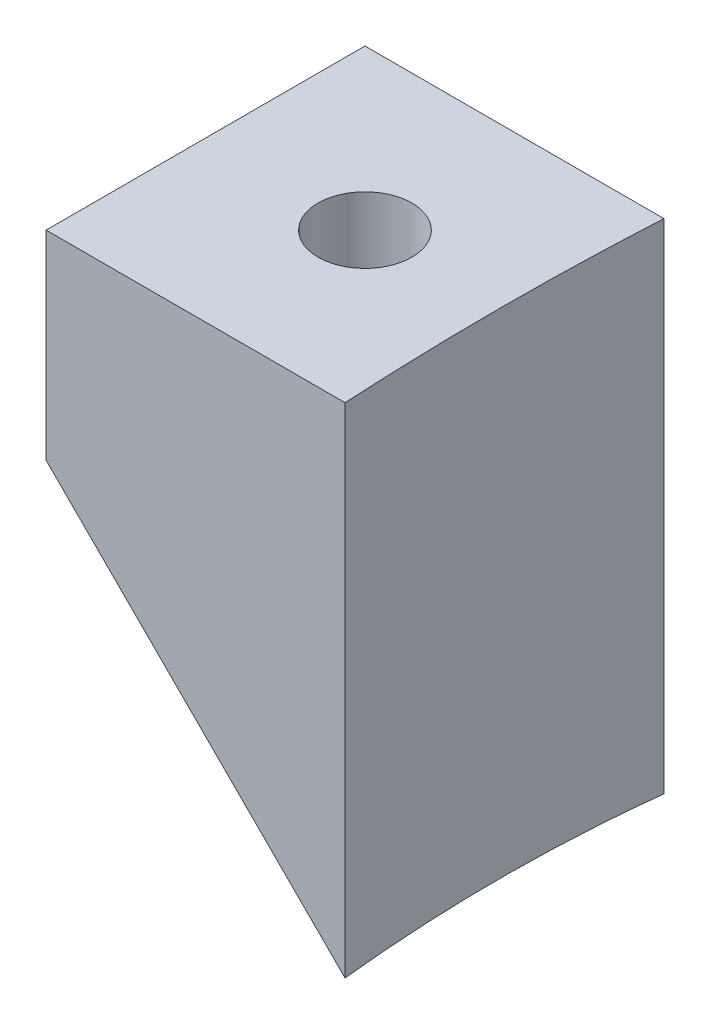
ISO-10303-21;
HEADER;
FILE_DESCRIPTION(('STEP AP214'),'2;1');
FILE_NAME('part.step','',(''),(''),'','','');
FILE_SCHEMA(('AUTOMOTIVE_DESIGN { 1 0 10303 214 1 1 1 1 }'));
ENDSEC;
DATA;
#1=APPLICATION_CONTEXT('core data for automotive mechanical design processes');
#2=APPLICATION_PROTOCOL_DEFINITION('international standard','automotive_design',2000,#1);
#3=PRODUCT_CONTEXT('',#1,'mechanical');
#4=PRODUCT('Part','Part','',(#3));
#5=PRODUCT_RELATED_PRODUCT_CATEGORY('part','',(#4));
#6=PRODUCT_DEFINITION_FORMATION('','',#4);
#7=PRODUCT_DEFINITION_CONTEXT('part definition',#1,'design');
#8=PRODUCT_DEFINITION('design','',#6,#7);
#9=PRODUCT_DEFINITION_SHAPE('','',#8);
#10=(LENGTH_UNIT() NAMED_UNIT(*) SI_UNIT(.MILLI.,.METRE.));
#11=(NAMED_UNIT(*) PLANE_ANGLE_UNIT() SI_UNIT($,.RADIAN.));
#12=(NAMED_UNIT(*) SI_UNIT($,.STERADIAN.) SOLID_ANGLE_UNIT());
#13=UNCERTAINTY_MEASURE_WITH_UNIT(LENGTH_MEASURE(1.E-05),#10,'distance_accuracy_value','');
#14=(GEOMETRIC_REPRESENTATION_CONTEXT(3) GLOBAL_UNCERTAINTY_ASSIGNED_CONTEXT((#13)) GLOBAL_UNIT_ASSIGNED_CONTEXT((#10,
#11,#12)) REPRESENTATION_CONTEXT('',''));
#15=CARTESIAN_POINT('',(0.,0.,0.));
#16=DIRECTION('',(0.,0.,1.));
#17=DIRECTION('',(1.,0.,0.));
#18=AXIS2_PLACEMENT_3D('',#15,#16,#17);
#19=CARTESIAN_POINT('',(0.,22.016162892,0.));
#20=DIRECTION('',(0.,1.,0.));
#21=DIRECTION('',(0.,0.,1.));
#22=AXIS2_PLACEMENT_3D('',#19,#20,#21);
#23=CYLINDRICAL_SURFACE('',#22,184.298091778145);
#24=DIRECTION('',(0.,1.,0.));
#25=VECTOR('',#24,1.);
#26=CARTESIAN_POINT('',(-184.017828030508,22.016162892,10.16));
#27=LINE('',#26,#25);
#28=CARTESIAN_POINT('',(-184.017828030508,41.0661628920005,10.16));
#29=VERTEX_POINT('',#28);
#30=CARTESIAN_POINT('',(-184.017828030508,72.816162892,10.16));
#31=VERTEX_POINT('',#30);
#32=EDGE_CURVE('E11',#29,#31,#27,.T.);
#33=ORIENTED_EDGE('',*,*,#32,.F.);
#34=CARTESIAN_POINT('',(0.,-142.95166513851,0.));
#35=DIRECTION('',(-0.707106781186551,-0.707106781186544,0.));
#36=DIRECTION('',(-0.707106781186544,0.707106781186551,0.));
#37=AXIS2_PLACEMENT_3D('',#34,#35,#36);
#38=ELLIPSE('',#37,260.636860912136,184.298091778145);
#39=CARTESIAN_POINT('',(-184.017828030508,41.0661628920004,-10.16));
#40=VERTEX_POINT('',#39);
#41=EDGE_CURVE('E25',#29,#40,#38,.T.);
#42=ORIENTED_EDGE('',*,*,#41,.T.);
#43=DIRECTION('',(0.,1.,0.));
#44=VECTOR('',#43,1.);
#45=CARTESIAN_POINT('',(-184.017828030508,22.016162892,-10.16));
#46=LINE('',#45,#44);
#47=CARTESIAN_POINT('',(-184.017828030508,72.816162892,-10.16));
#48=VERTEX_POINT('',#47);
#49=EDGE_CURVE('E115',#40,#48,#46,.T.);
#50=ORIENTED_EDGE('',*,*,#49,.T.);
#51=CARTESIAN_POINT('',(0.,72.816162892,0.));
#52=DIRECTION('',(0.,-1.,0.));
#53=DIRECTION('',(0.,0.,1.));
#54=AXIS2_PLACEMENT_3D('',#51,#52,#53);
#55=CIRCLE('',#54,184.298091778145);
#56=EDGE_CURVE('E91',#31,#48,#55,.T.);
#57=ORIENTED_EDGE('',*,*,#56,.F.);
#58=EDGE_LOOP('',(#33,#42,#50,#57));
#59=FACE_BOUND('',#58,.T.);
#60=ADVANCED_FACE('F17',(#59),#23,.F.);
#61=CARTESIAN_POINT('',(-184.017828030508,22.016162892,10.16));
#62=DIRECTION('',(0.,0.,1.));
#63=DIRECTION('',(1.,0.,0.));
#64=AXIS2_PLACEMENT_3D('',#61,#62,#63);
#65=PLANE('',#64);
#66=DIRECTION('',(0.,1.,0.));
#67=VECTOR('',#66,1.);
#68=CARTESIAN_POINT('',(-203.067828030508,22.016162892,10.16));
#69=LINE('',#68,#67);
#70=CARTESIAN_POINT('',(-203.067828030508,60.1161628920007,10.16));
#71=VERTEX_POINT('',#70);
#72=CARTESIAN_POINT('',(-203.067828030508,72.816162892,10.16));
#73=VERTEX_POINT('',#72);
#74=EDGE_CURVE('E72',#71,#73,#69,.T.);
#75=ORIENTED_EDGE('',*,*,#74,.F.);
#76=DIRECTION('',(0.707106781186544,-0.707106781186551,0.));
#77=VECTOR('',#76,1.);
#78=CARTESIAN_POINT('',(-174.492828030508,31.5411628920001,10.16));
#79=LINE('',#78,#77);
#80=EDGE_CURVE('E108',#71,#29,#79,.T.);
#81=ORIENTED_EDGE('',*,*,#80,.T.);
#82=ORIENTED_EDGE('',*,*,#32,.T.);
#83=DIRECTION('',(1.,0.,0.));
#84=VECTOR('',#83,1.);
#85=CARTESIAN_POINT('',(-184.017828030508,72.816162892,10.16));
#86=LINE('',#85,#84);
#87=EDGE_CURVE('E88',#73,#31,#86,.T.);
#88=ORIENTED_EDGE('',*,*,#87,.F.);
#89=EDGE_LOOP('',(#75,#81,#82,#88));
#90=FACE_BOUND('',#89,.T.);
#91=ADVANCED_FACE('F135',(#90),#65,.T.);
#92=CARTESIAN_POINT('',(-203.067828030508,22.016162892,-10.16));
#93=DIRECTION('',(-1.,0.,0.));
#94=DIRECTION('',(0.,0.,1.));
#95=AXIS2_PLACEMENT_3D('',#92,#93,#94);
#96=PLANE('',#95);
#97=DIRECTION('',(0.,1.,0.));
#98=VECTOR('',#97,1.);
#99=CARTESIAN_POINT('',(-203.067828030508,22.016162892,-10.16));
#100=LINE('',#99,#98);
#101=CARTESIAN_POINT('',(-203.067828030508,60.1161628920007,-10.16));
#102=VERTEX_POINT('',#101);
#103=CARTESIAN_POINT('',(-203.067828030508,72.816162892,-10.16));
#104=VERTEX_POINT('',#103);
#105=EDGE_CURVE('E70',#102,#104,#100,.T.);
#106=ORIENTED_EDGE('',*,*,#105,.F.);
#107=DIRECTION('',(0.,0.,1.));
#108=VECTOR('',#107,1.);
#109=CARTESIAN_POINT('',(-203.067828030508,60.1161628920007,10.16));
#110=LINE('',#109,#108);
#111=EDGE_CURVE('E77',#102,#71,#110,.T.);
#112=ORIENTED_EDGE('',*,*,#111,.T.);
#113=ORIENTED_EDGE('',*,*,#74,.T.);
#114=DIRECTION('',(0.,0.,1.));
#115=VECTOR('',#114,1.);
#116=CARTESIAN_POINT('',(-203.067828030508,72.816162892,-10.16));
#117=LINE('',#116,#115);
#118=EDGE_CURVE('E66',#104,#73,#117,.T.);
#119=ORIENTED_EDGE('',*,*,#118,.F.);
#120=EDGE_LOOP('',(#106,#112,#113,#119));
#121=FACE_BOUND('',#120,.T.);
#122=ADVANCED_FACE('F68',(#121),#96,.T.);
#123=CARTESIAN_POINT('',(-184.017828030508,22.016162892,-10.16));
#124=DIRECTION('',(0.,0.,-1.));
#125=DIRECTION('',(-1.,0.,0.));
#126=AXIS2_PLACEMENT_3D('',#123,#124,#125);
#127=PLANE('',#126);
#128=ORIENTED_EDGE('',*,*,#49,.F.);
#129=DIRECTION('',(-0.707106781186544,0.707106781186551,0.));
#130=VECTOR('',#129,1.);
#131=CARTESIAN_POINT('',(-174.492828030508,31.5411628920001,-10.16));
#132=LINE('',#131,#130);
#133=EDGE_CURVE('E78',#40,#102,#132,.T.);
#134=ORIENTED_EDGE('',*,*,#133,.T.);
#135=ORIENTED_EDGE('',*,*,#105,.T.);
#136=DIRECTION('',(-1.,0.,0.));
#137=VECTOR('',#136,1.);
#138=CARTESIAN_POINT('',(-184.017828030508,72.816162892,-10.16));
#139=LINE('',#138,#137);
#140=EDGE_CURVE('E83',#48,#104,#139,.T.);
#141=ORIENTED_EDGE('',*,*,#140,.F.);
#142=EDGE_LOOP('',(#128,#134,#135,#141));
#143=FACE_BOUND('',#142,.T.);
#144=ADVANCED_FACE('F82',(#143),#127,.T.);
#145=CARTESIAN_POINT('',(0.,72.816162892,0.));
#146=DIRECTION('',(0.,1.,0.));
#147=DIRECTION('',(0.,0.,1.));
#148=AXIS2_PLACEMENT_3D('',#145,#146,#147);
#149=PLANE('',#148);
#150=CARTESIAN_POINT('',(-192.907828030508,72.816162892,0.));
#151=DIRECTION('',(0.,1.,0.));
#152=DIRECTION('',(0.,0.,1.));
#153=AXIS2_PLACEMENT_3D('',#150,#151,#152);
#154=CIRCLE('',#153,2.99085);
#155=CARTESIAN_POINT('',(-192.907828030508,72.816162892,2.99085));
#156=VERTEX_POINT('',#155);
#157=EDGE_CURVE('E93',#156,#156,#154,.T.);
#158=ORIENTED_EDGE('',*,*,#157,.F.);
#159=EDGE_LOOP('',(#158));
#160=FACE_BOUND('',#159,.T.);
#161=ORIENTED_EDGE('',*,*,#56,.T.);
#162=ORIENTED_EDGE('',*,*,#140,.T.);
#163=ORIENTED_EDGE('',*,*,#118,.T.);
#164=ORIENTED_EDGE('',*,*,#87,.T.);
#165=EDGE_LOOP('',(#161,#162,#163,#164));
#166=FACE_BOUND('',#165,.T.);
#167=ADVANCED_FACE('F90',(#160,#166),#149,.T.);
#168=CARTESIAN_POINT('',(-203.067828030508,60.1161628920007,-10.16));
#169=DIRECTION('',(-0.707106781186551,-0.707106781186544,0.));
#170=DIRECTION('',(0.,0.,-1.));
#171=AXIS2_PLACEMENT_3D('',#168,#169,#170);
#172=PLANE('',#171);
#173=ORIENTED_EDGE('',*,*,#133,.F.);
#174=ORIENTED_EDGE('',*,*,#41,.F.);
#175=ORIENTED_EDGE('',*,*,#80,.F.);
#176=ORIENTED_EDGE('',*,*,#111,.F.);
#177=EDGE_LOOP('',(#173,#174,#175,#176));
#178=FACE_BOUND('',#177,.T.);
#179=ADVANCED_FACE('F132',(#178),#172,.T.);
#180=CARTESIAN_POINT('',(-192.907828030508,62.656162892,0.));
#181=DIRECTION('',(0.,1.,0.));
#182=DIRECTION('',(0.,0.,1.));
#183=AXIS2_PLACEMENT_3D('',#180,#181,#182);
#184=CYLINDRICAL_SURFACE('',#183,2.99085);
#185=CARTESIAN_POINT('',(-192.907828030508,62.656162892,0.));
#186=DIRECTION('',(0.,1.,0.));
#187=DIRECTION('',(0.,0.,1.));
#188=AXIS2_PLACEMENT_3D('',#185,#186,#187);
#189=CIRCLE('',#188,2.99085);
#190=CARTESIAN_POINT('',(-192.907828030508,62.656162892,2.99085));
#191=VERTEX_POINT('',#190);
#192=EDGE_CURVE('E100',#191,#191,#189,.T.);
#193=ORIENTED_EDGE('',*,*,#192,.F.);
#194=EDGE_LOOP('',(#193));
#195=FACE_BOUND('',#194,.T.);
#196=ORIENTED_EDGE('',*,*,#157,.T.);
#197=EDGE_LOOP('',(#196));
#198=FACE_BOUND('',#197,.T.);
#199=ADVANCED_FACE('F151',(#195,#198),#184,.F.);
#200=CARTESIAN_POINT('',(-192.907828030508,62.656162892,0.));
#201=DIRECTION('',(0.,1.,0.));
#202=DIRECTION('',(0.,0.,1.));
#203=AXIS2_PLACEMENT_3D('',#200,#201,#202);
#204=PLANE('',#203);
#205=ORIENTED_EDGE('',*,*,#192,.T.);
#206=EDGE_LOOP('',(#205));
#207=FACE_BOUND('',#206,.T.);
#208=ADVANCED_FACE('F154',(#207),#204,.T.);
#209=CLOSED_SHELL('',(#60,#91,#122,#144,#167,#179,#199,#208));
#210=MANIFOLD_SOLID_BREP('B1',#209);
#211=ADVANCED_BREP_SHAPE_REPRESENTATION('',(#18,#210),#14);
#212=SHAPE_DEFINITION_REPRESENTATION(#9,#211);
ENDSEC;
END-ISO-10303-21;
